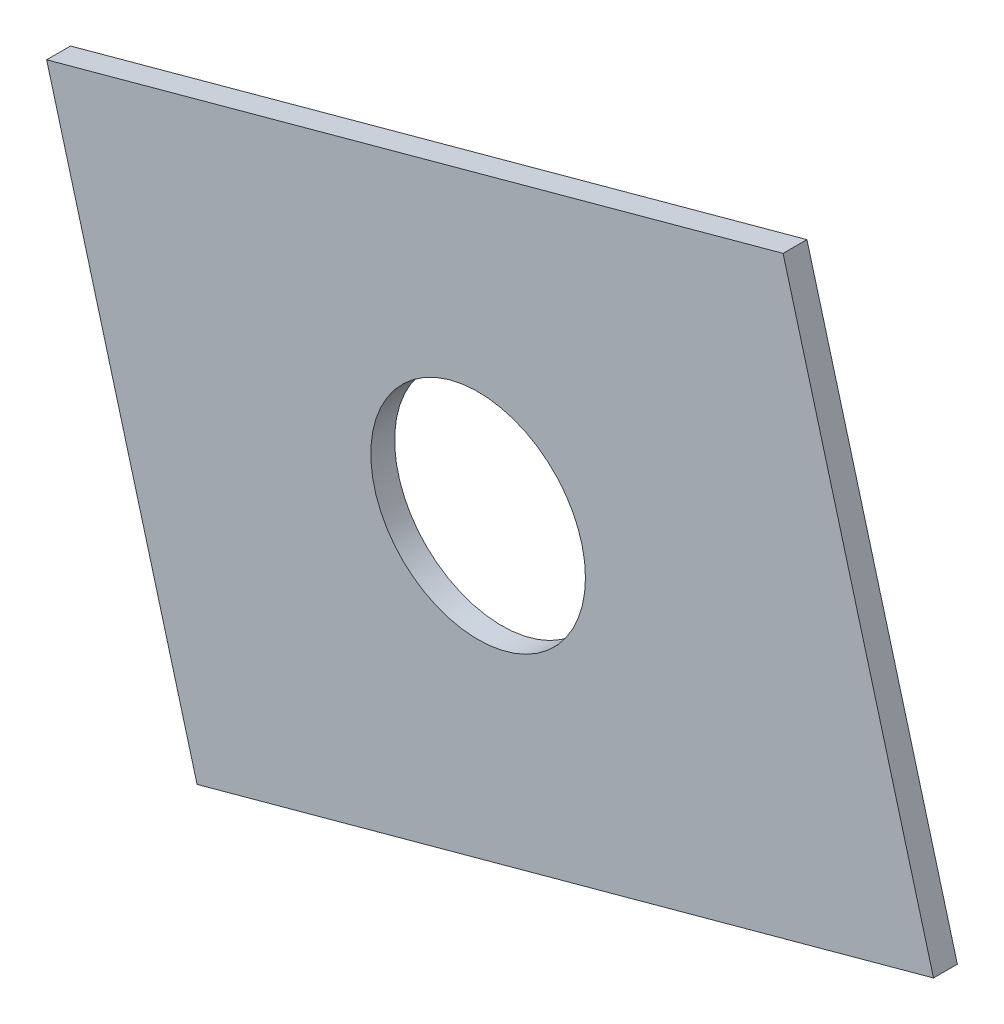
ISO-10303-21;
HEADER;
FILE_DESCRIPTION(('STEP AP214'),'2;1');
FILE_NAME('part.step','',(''),(''),'','','');
FILE_SCHEMA(('AUTOMOTIVE_DESIGN { 1 0 10303 214 1 1 1 1 }'));
ENDSEC;
DATA;
#1=APPLICATION_CONTEXT('core data for automotive mechanical design processes');
#2=APPLICATION_PROTOCOL_DEFINITION('international standard','automotive_design',2000,#1);
#3=PRODUCT_CONTEXT('',#1,'mechanical');
#4=PRODUCT('Part','Part','',(#3));
#5=PRODUCT_RELATED_PRODUCT_CATEGORY('part','',(#4));
#6=PRODUCT_DEFINITION_FORMATION('','',#4);
#7=PRODUCT_DEFINITION_CONTEXT('part definition',#1,'design');
#8=PRODUCT_DEFINITION('design','',#6,#7);
#9=PRODUCT_DEFINITION_SHAPE('','',#8);
#10=(LENGTH_UNIT() NAMED_UNIT(*) SI_UNIT(.MILLI.,.METRE.));
#11=(NAMED_UNIT(*) PLANE_ANGLE_UNIT() SI_UNIT($,.RADIAN.));
#12=(NAMED_UNIT(*) SI_UNIT($,.STERADIAN.) SOLID_ANGLE_UNIT());
#13=UNCERTAINTY_MEASURE_WITH_UNIT(LENGTH_MEASURE(1.E-05),#10,'distance_accuracy_value','');
#14=(GEOMETRIC_REPRESENTATION_CONTEXT(3) GLOBAL_UNCERTAINTY_ASSIGNED_CONTEXT((#13)) GLOBAL_UNIT_ASSIGNED_CONTEXT((#10,
#11,#12)) REPRESENTATION_CONTEXT('',''));
#15=CARTESIAN_POINT('',(0.,0.,0.));
#16=DIRECTION('',(0.,0.,1.));
#17=DIRECTION('',(1.,0.,0.));
#18=AXIS2_PLACEMENT_3D('',#15,#16,#17);
#19=CARTESIAN_POINT('',(0.,0.,3.175));
#20=DIRECTION('',(0.,0.,1.));
#21=DIRECTION('',(1.,0.,0.));
#22=AXIS2_PLACEMENT_3D('',#19,#20,#21);
#23=PLANE('',#22);
#24=DIRECTION('',(-0.262769032590575,0.964858764540911,0.));
#25=VECTOR('',#24,1.);
#26=CARTESIAN_POINT('',(197.225330237734,39.2829274398382,3.175));
#27=LINE('',#26,#25);
#28=CARTESIAN_POINT('',(197.225330237734,39.2829274398382,3.175));
#29=VERTEX_POINT('',#28);
#30=CARTESIAN_POINT('',(177.202329954332,112.805165297856,3.175));
#31=VERTEX_POINT('',#30);
#32=EDGE_CURVE('E89',#29,#31,#27,.T.);
#33=ORIENTED_EDGE('',*,*,#32,.T.);
#34=DIRECTION('',(-0.964858764540911,-0.262769032590574,0.));
#35=VECTOR('',#34,1.);
#36=CARTESIAN_POINT('',(177.202329954332,112.805165297856,3.175));
#37=LINE('',#36,#35);
#38=CARTESIAN_POINT('',(79.1726794769754,86.1078315866534,3.175));
#39=VERTEX_POINT('',#38);
#40=EDGE_CURVE('E84',#31,#39,#37,.T.);
#41=ORIENTED_EDGE('',*,*,#40,.T.);
#42=DIRECTION('',(0.262769032590575,-0.964858764540911,0.));
#43=VECTOR('',#42,1.);
#44=CARTESIAN_POINT('',(79.1726794769754,86.1078315866534,3.175));
#45=LINE('',#44,#43);
#46=CARTESIAN_POINT('',(99.1956797603772,12.5855937286359,3.175));
#47=VERTEX_POINT('',#46);
#48=EDGE_CURVE('E87',#39,#47,#45,.T.);
#49=ORIENTED_EDGE('',*,*,#48,.T.);
#50=DIRECTION('',(0.964858764540911,0.262769032590575,0.));
#51=VECTOR('',#50,1.);
#52=CARTESIAN_POINT('',(99.1956797603772,12.5855937286359,3.175));
#53=LINE('',#52,#51);
#54=EDGE_CURVE('E54',#47,#29,#53,.T.);
#55=ORIENTED_EDGE('',*,*,#54,.T.);
#56=EDGE_LOOP('',(#33,#41,#49,#55));
#57=FACE_BOUND('',#56,.T.);
#58=CARTESIAN_POINT('',(136.607006945836,62.2618157975363,3.175));
#59=DIRECTION('',(0.,0.,1.));
#60=DIRECTION('',(1.,0.,0.));
#61=AXIS2_PLACEMENT_3D('',#58,#59,#60);
#62=CIRCLE('',#61,14.287499999999);
#63=CARTESIAN_POINT('',(150.894506945835,62.2618157975363,3.175));
#64=VERTEX_POINT('',#63);
#65=EDGE_CURVE('E104',#64,#64,#62,.T.);
#66=ORIENTED_EDGE('',*,*,#65,.F.);
#67=EDGE_LOOP('',(#66));
#68=FACE_BOUND('',#67,.T.);
#69=ADVANCED_FACE('F37',(#57,#68),#23,.T.);
#70=CARTESIAN_POINT('',(0.,0.,0.));
#71=DIRECTION('',(0.,0.,1.));
#72=DIRECTION('',(1.,0.,0.));
#73=AXIS2_PLACEMENT_3D('',#70,#71,#72);
#74=PLANE('',#73);
#75=DIRECTION('',(-0.262769032590575,0.964858764540911,0.));
#76=VECTOR('',#75,1.);
#77=CARTESIAN_POINT('',(197.225330237734,39.2829274398382,0.));
#78=LINE('',#77,#76);
#79=CARTESIAN_POINT('',(197.225330237734,39.2829274398382,0.));
#80=VERTEX_POINT('',#79);
#81=CARTESIAN_POINT('',(177.202329954332,112.805165297856,0.));
#82=VERTEX_POINT('',#81);
#83=EDGE_CURVE('E101',#80,#82,#78,.T.);
#84=ORIENTED_EDGE('',*,*,#83,.F.);
#85=DIRECTION('',(0.964858764540911,0.262769032590575,0.));
#86=VECTOR('',#85,1.);
#87=CARTESIAN_POINT('',(99.1956797603772,12.5855937286359,0.));
#88=LINE('',#87,#86);
#89=CARTESIAN_POINT('',(99.1956797603772,12.5855937286359,0.));
#90=VERTEX_POINT('',#89);
#91=EDGE_CURVE('E77',#90,#80,#88,.T.);
#92=ORIENTED_EDGE('',*,*,#91,.F.);
#93=DIRECTION('',(0.262769032590575,-0.964858764540911,0.));
#94=VECTOR('',#93,1.);
#95=CARTESIAN_POINT('',(79.1726794769754,86.1078315866534,0.));
#96=LINE('',#95,#94);
#97=CARTESIAN_POINT('',(79.1726794769754,86.1078315866534,0.));
#98=VERTEX_POINT('',#97);
#99=EDGE_CURVE('E71',#98,#90,#96,.T.);
#100=ORIENTED_EDGE('',*,*,#99,.F.);
#101=DIRECTION('',(-0.964858764540911,-0.262769032590574,0.));
#102=VECTOR('',#101,1.);
#103=CARTESIAN_POINT('',(177.202329954332,112.805165297856,0.));
#104=LINE('',#103,#102);
#105=EDGE_CURVE('E93',#82,#98,#104,.T.);
#106=ORIENTED_EDGE('',*,*,#105,.F.);
#107=EDGE_LOOP('',(#84,#92,#100,#106));
#108=FACE_BOUND('',#107,.T.);
#109=CARTESIAN_POINT('',(136.607006945836,62.2618157975363,0.));
#110=DIRECTION('',(0.,0.,1.));
#111=DIRECTION('',(1.,0.,0.));
#112=AXIS2_PLACEMENT_3D('',#109,#110,#111);
#113=CIRCLE('',#112,14.287499999999);
#114=CARTESIAN_POINT('',(150.894506945835,62.2618157975363,0.));
#115=VERTEX_POINT('',#114);
#116=EDGE_CURVE('E116',#115,#115,#113,.T.);
#117=ORIENTED_EDGE('',*,*,#116,.T.);
#118=EDGE_LOOP('',(#117));
#119=FACE_BOUND('',#118,.T.);
#120=ADVANCED_FACE('F112',(#108,#119),#74,.F.);
#121=CARTESIAN_POINT('',(197.225330237734,39.2829274398382,3.175));
#122=DIRECTION('',(-0.964858764540911,-0.262769032590575,0.));
#123=DIRECTION('',(0.262769032590576,-0.964858764540911,0.));
#124=AXIS2_PLACEMENT_3D('',#121,#122,#123);
#125=PLANE('',#124);
#126=ORIENTED_EDGE('',*,*,#83,.T.);
#127=DIRECTION('',(0.,0.,-1.));
#128=VECTOR('',#127,1.);
#129=CARTESIAN_POINT('',(177.202329954332,112.805165297856,3.175));
#130=LINE('',#129,#128);
#131=EDGE_CURVE('E11',#31,#82,#130,.T.);
#132=ORIENTED_EDGE('',*,*,#131,.F.);
#133=ORIENTED_EDGE('',*,*,#32,.F.);
#134=DIRECTION('',(0.,0.,-1.));
#135=VECTOR('',#134,1.);
#136=CARTESIAN_POINT('',(197.225330237734,39.2829274398382,3.175));
#137=LINE('',#136,#135);
#138=EDGE_CURVE('E97',#29,#80,#137,.T.);
#139=ORIENTED_EDGE('',*,*,#138,.T.);
#140=EDGE_LOOP('',(#126,#132,#133,#139));
#141=FACE_BOUND('',#140,.T.);
#142=ADVANCED_FACE('F39',(#141),#125,.F.);
#143=CARTESIAN_POINT('',(177.202329954332,112.805165297856,3.175));
#144=DIRECTION('',(0.262769032590574,-0.964858764540911,0.));
#145=DIRECTION('',(0.964858764540911,0.262769032590574,0.));
#146=AXIS2_PLACEMENT_3D('',#143,#144,#145);
#147=PLANE('',#146);
#148=ORIENTED_EDGE('',*,*,#105,.T.);
#149=DIRECTION('',(0.,0.,-1.));
#150=VECTOR('',#149,1.);
#151=CARTESIAN_POINT('',(79.1726794769754,86.1078315866534,3.175));
#152=LINE('',#151,#150);
#153=EDGE_CURVE('E46',#39,#98,#152,.T.);
#154=ORIENTED_EDGE('',*,*,#153,.F.);
#155=ORIENTED_EDGE('',*,*,#40,.F.);
#156=ORIENTED_EDGE('',*,*,#131,.T.);
#157=EDGE_LOOP('',(#148,#154,#155,#156));
#158=FACE_BOUND('',#157,.T.);
#159=ADVANCED_FACE('F92',(#158),#147,.F.);
#160=CARTESIAN_POINT('',(79.1726794769754,86.1078315866534,3.175));
#161=DIRECTION('',(0.964858764540911,0.262769032590575,0.));
#162=DIRECTION('',(-0.262769032590575,0.964858764540911,0.));
#163=AXIS2_PLACEMENT_3D('',#160,#161,#162);
#164=PLANE('',#163);
#165=ORIENTED_EDGE('',*,*,#99,.T.);
#166=DIRECTION('',(0.,0.,-1.));
#167=VECTOR('',#166,1.);
#168=CARTESIAN_POINT('',(99.1956797603772,12.5855937286359,3.175));
#169=LINE('',#168,#167);
#170=EDGE_CURVE('E94',#47,#90,#169,.T.);
#171=ORIENTED_EDGE('',*,*,#170,.F.);
#172=ORIENTED_EDGE('',*,*,#48,.F.);
#173=ORIENTED_EDGE('',*,*,#153,.T.);
#174=EDGE_LOOP('',(#165,#171,#172,#173));
#175=FACE_BOUND('',#174,.T.);
#176=ADVANCED_FACE('F95',(#175),#164,.F.);
#177=CARTESIAN_POINT('',(99.1956797603772,12.5855937286359,3.175));
#178=DIRECTION('',(-0.262769032590574,0.964858764540911,0.));
#179=DIRECTION('',(-0.964858764540911,-0.262769032590575,0.));
#180=AXIS2_PLACEMENT_3D('',#177,#178,#179);
#181=PLANE('',#180);
#182=ORIENTED_EDGE('',*,*,#91,.T.);
#183=ORIENTED_EDGE('',*,*,#138,.F.);
#184=ORIENTED_EDGE('',*,*,#54,.F.);
#185=ORIENTED_EDGE('',*,*,#170,.T.);
#186=EDGE_LOOP('',(#182,#183,#184,#185));
#187=FACE_BOUND('',#186,.T.);
#188=ADVANCED_FACE('F109',(#187),#181,.F.);
#189=CARTESIAN_POINT('',(136.607006945836,62.2618157975363,3.175));
#190=DIRECTION('',(0.,0.,-1.));
#191=DIRECTION('',(-1.,0.,0.));
#192=AXIS2_PLACEMENT_3D('',#189,#190,#191);
#193=CYLINDRICAL_SURFACE('',#192,14.287499999999);
#194=ORIENTED_EDGE('',*,*,#65,.T.);
#195=EDGE_LOOP('',(#194));
#196=FACE_BOUND('',#195,.T.);
#197=ORIENTED_EDGE('',*,*,#116,.F.);
#198=EDGE_LOOP('',(#197));
#199=FACE_BOUND('',#198,.T.);
#200=ADVANCED_FACE('F122',(#196,#199),#193,.F.);
#201=CLOSED_SHELL('',(#69,#120,#142,#159,#176,#188,#200));
#202=MANIFOLD_SOLID_BREP('B2',#201);
#203=ADVANCED_BREP_SHAPE_REPRESENTATION('',(#18,#202),#14);
#204=SHAPE_DEFINITION_REPRESENTATION(#9,#203);
ENDSEC;
END-ISO-10303-21;
